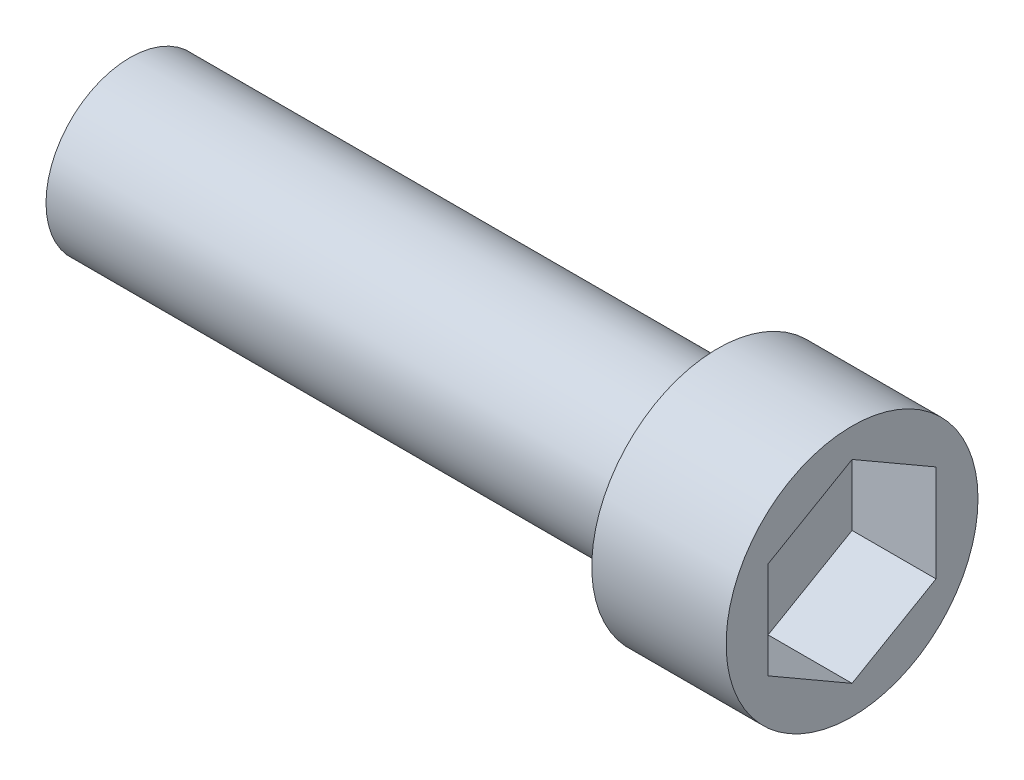
ISO-10303-21;
HEADER;
FILE_DESCRIPTION(('STEP AP214'),'2;1');
FILE_NAME('part.step','',(''),(''),'','','');
FILE_SCHEMA(('AUTOMOTIVE_DESIGN { 1 0 10303 214 1 1 1 1 }'));
ENDSEC;
DATA;
#1=APPLICATION_CONTEXT('core data for automotive mechanical design processes');
#2=APPLICATION_PROTOCOL_DEFINITION('international standard','automotive_design',2000,#1);
#3=PRODUCT_CONTEXT('',#1,'mechanical');
#4=PRODUCT('Part','Part','',(#3));
#5=PRODUCT_RELATED_PRODUCT_CATEGORY('part','',(#4));
#6=PRODUCT_DEFINITION_FORMATION('','',#4);
#7=PRODUCT_DEFINITION_CONTEXT('part definition',#1,'design');
#8=PRODUCT_DEFINITION('design','',#6,#7);
#9=PRODUCT_DEFINITION_SHAPE('','',#8);
#10=(LENGTH_UNIT() NAMED_UNIT(*) SI_UNIT(.MILLI.,.METRE.));
#11=(NAMED_UNIT(*) PLANE_ANGLE_UNIT() SI_UNIT($,.RADIAN.));
#12=(NAMED_UNIT(*) SI_UNIT($,.STERADIAN.) SOLID_ANGLE_UNIT());
#13=UNCERTAINTY_MEASURE_WITH_UNIT(LENGTH_MEASURE(1.E-05),#10,'distance_accuracy_value','');
#14=(GEOMETRIC_REPRESENTATION_CONTEXT(3) GLOBAL_UNCERTAINTY_ASSIGNED_CONTEXT((#13)) GLOBAL_UNIT_ASSIGNED_CONTEXT((#10,
#11,#12)) REPRESENTATION_CONTEXT('',''));
#15=CARTESIAN_POINT('',(0.,0.,0.));
#16=DIRECTION('',(0.,0.,1.));
#17=DIRECTION('',(1.,0.,0.));
#18=AXIS2_PLACEMENT_3D('',#15,#16,#17);
#19=CARTESIAN_POINT('',(8.,0.,0.));
#20=DIRECTION('',(-1.,0.,0.));
#21=DIRECTION('',(0.,0.,1.));
#22=AXIS2_PLACEMENT_3D('',#19,#20,#21);
#23=CYLINDRICAL_SURFACE('',#22,7.5);
#24=CARTESIAN_POINT('',(8.,0.,0.));
#25=DIRECTION('',(1.,0.,0.));
#26=DIRECTION('',(0.,0.,-1.));
#27=AXIS2_PLACEMENT_3D('',#24,#25,#26);
#28=CIRCLE('',#27,7.5);
#29=CARTESIAN_POINT('',(8.,0.,-7.5));
#30=VERTEX_POINT('',#29);
#31=EDGE_CURVE('E48',#30,#30,#28,.T.);
#32=ORIENTED_EDGE('',*,*,#31,.F.);
#33=EDGE_LOOP('',(#32));
#34=FACE_BOUND('',#33,.T.);
#35=CARTESIAN_POINT('',(0.,0.,0.));
#36=DIRECTION('',(1.,0.,0.));
#37=DIRECTION('',(0.,0.,-1.));
#38=AXIS2_PLACEMENT_3D('',#35,#36,#37);
#39=CIRCLE('',#38,7.5);
#40=CARTESIAN_POINT('',(0.,0.,-7.5));
#41=VERTEX_POINT('',#40);
#42=EDGE_CURVE('E143',#41,#41,#39,.T.);
#43=ORIENTED_EDGE('',*,*,#42,.T.);
#44=EDGE_LOOP('',(#43));
#45=FACE_BOUND('',#44,.T.);
#46=ADVANCED_FACE('F41',(#34,#45),#23,.T.);
#47=CARTESIAN_POINT('',(8.,0.,0.));
#48=DIRECTION('',(1.,0.,0.));
#49=DIRECTION('',(0.,0.,-1.));
#50=AXIS2_PLACEMENT_3D('',#47,#48,#49);
#51=PLANE('',#50);
#52=DIRECTION('',(0.,-0.5,-0.866025403784439));
#53=VECTOR('',#52,1.);
#54=CARTESIAN_POINT('',(8.,-2.88675134594815,5.00000000000004));
#55=LINE('',#54,#53);
#56=CARTESIAN_POINT('',(8.,-2.88675134594815,5.00000000000004));
#57=VERTEX_POINT('',#56);
#58=CARTESIAN_POINT('',(8.,-5.77350269189631,0.));
#59=VERTEX_POINT('',#58);
#60=EDGE_CURVE('E55',#57,#59,#55,.T.);
#61=ORIENTED_EDGE('',*,*,#60,.F.);
#62=DIRECTION('',(0.,-1.,0.));
#63=VECTOR('',#62,1.);
#64=CARTESIAN_POINT('',(8.,2.88675134594815,5.00000000000004));
#65=LINE('',#64,#63);
#66=CARTESIAN_POINT('',(8.,2.88675134594815,5.00000000000004));
#67=VERTEX_POINT('',#66);
#68=EDGE_CURVE('E139',#67,#57,#65,.T.);
#69=ORIENTED_EDGE('',*,*,#68,.F.);
#70=DIRECTION('',(0.,-0.5,0.866025403784439));
#71=VECTOR('',#70,1.);
#72=CARTESIAN_POINT('',(8.,5.77350269189631,0.));
#73=LINE('',#72,#71);
#74=CARTESIAN_POINT('',(8.,5.77350269189631,0.));
#75=VERTEX_POINT('',#74);
#76=EDGE_CURVE('E137',#75,#67,#73,.T.);
#77=ORIENTED_EDGE('',*,*,#76,.F.);
#78=DIRECTION('',(0.,0.5,0.866025403784439));
#79=VECTOR('',#78,1.);
#80=CARTESIAN_POINT('',(8.,2.88675134594815,-5.00000000000004));
#81=LINE('',#80,#79);
#82=CARTESIAN_POINT('',(8.,2.88675134594815,-5.00000000000004));
#83=VERTEX_POINT('',#82);
#84=EDGE_CURVE('E103',#83,#75,#81,.T.);
#85=ORIENTED_EDGE('',*,*,#84,.F.);
#86=DIRECTION('',(0.,1.,0.));
#87=VECTOR('',#86,1.);
#88=CARTESIAN_POINT('',(8.,-2.88675134594815,-5.00000000000004));
#89=LINE('',#88,#87);
#90=CARTESIAN_POINT('',(8.,-2.88675134594815,-5.00000000000004));
#91=VERTEX_POINT('',#90);
#92=EDGE_CURVE('E133',#91,#83,#89,.T.);
#93=ORIENTED_EDGE('',*,*,#92,.F.);
#94=DIRECTION('',(0.,0.5,-0.866025403784439));
#95=VECTOR('',#94,1.);
#96=CARTESIAN_POINT('',(8.,-5.77350269189631,0.));
#97=LINE('',#96,#95);
#98=EDGE_CURVE('E129',#59,#91,#97,.T.);
#99=ORIENTED_EDGE('',*,*,#98,.F.);
#100=EDGE_LOOP('',(#61,#69,#77,#85,#93,#99));
#101=FACE_BOUND('',#100,.T.);
#102=ORIENTED_EDGE('',*,*,#31,.T.);
#103=EDGE_LOOP('',(#102));
#104=FACE_BOUND('',#103,.T.);
#105=ADVANCED_FACE('F157',(#101,#104),#51,.T.);
#106=CARTESIAN_POINT('',(0.,0.,0.));
#107=DIRECTION('',(1.,0.,0.));
#108=DIRECTION('',(0.,0.,-1.));
#109=AXIS2_PLACEMENT_3D('',#106,#107,#108);
#110=PLANE('',#109);
#111=CARTESIAN_POINT('',(0.,0.,0.));
#112=DIRECTION('',(1.,0.,0.));
#113=DIRECTION('',(0.,0.,-1.));
#114=AXIS2_PLACEMENT_3D('',#111,#112,#113);
#115=CIRCLE('',#114,5.);
#116=CARTESIAN_POINT('',(0.,0.,-5.));
#117=VERTEX_POINT('',#116);
#118=EDGE_CURVE('E12',#117,#117,#115,.F.);
#119=ORIENTED_EDGE('',*,*,#118,.F.);
#120=EDGE_LOOP('',(#119));
#121=FACE_BOUND('',#120,.T.);
#122=ORIENTED_EDGE('',*,*,#42,.F.);
#123=EDGE_LOOP('',(#122));
#124=FACE_BOUND('',#123,.T.);
#125=ADVANCED_FACE('F154',(#121,#124),#110,.F.);
#126=CARTESIAN_POINT('',(3.,-2.88675134594815,5.00000000000004));
#127=DIRECTION('',(0.,-0.866025403784438,0.5));
#128=DIRECTION('',(0.,-0.5,-0.866025403784439));
#129=AXIS2_PLACEMENT_3D('',#126,#127,#128);
#130=PLANE('',#129);
#131=ORIENTED_EDGE('',*,*,#60,.T.);
#132=DIRECTION('',(1.,0.,0.));
#133=VECTOR('',#132,1.);
#134=CARTESIAN_POINT('',(3.,-5.77350269189631,0.));
#135=LINE('',#134,#133);
#136=CARTESIAN_POINT('',(3.,-5.77350269189631,0.));
#137=VERTEX_POINT('',#136);
#138=EDGE_CURVE('E85',#137,#59,#135,.T.);
#139=ORIENTED_EDGE('',*,*,#138,.F.);
#140=DIRECTION('',(0.,-0.5,-0.866025403784439));
#141=VECTOR('',#140,1.);
#142=CARTESIAN_POINT('',(3.,-2.88675134594815,5.00000000000004));
#143=LINE('',#142,#141);
#144=CARTESIAN_POINT('',(3.,-2.88675134594815,5.00000000000004));
#145=VERTEX_POINT('',#144);
#146=EDGE_CURVE('E141',#145,#137,#143,.T.);
#147=ORIENTED_EDGE('',*,*,#146,.F.);
#148=DIRECTION('',(1.,0.,0.));
#149=VECTOR('',#148,1.);
#150=CARTESIAN_POINT('',(3.,-2.88675134594815,5.00000000000004));
#151=LINE('',#150,#149);
#152=EDGE_CURVE('E63',#145,#57,#151,.T.);
#153=ORIENTED_EDGE('',*,*,#152,.T.);
#154=EDGE_LOOP('',(#131,#139,#147,#153));
#155=FACE_BOUND('',#154,.T.);
#156=ADVANCED_FACE('F156',(#155),#130,.F.);
#157=CARTESIAN_POINT('',(3.,2.88675134594815,5.00000000000004));
#158=DIRECTION('',(0.,0.,1.));
#159=DIRECTION('',(1.,0.,0.));
#160=AXIS2_PLACEMENT_3D('',#157,#158,#159);
#161=PLANE('',#160);
#162=ORIENTED_EDGE('',*,*,#68,.T.);
#163=ORIENTED_EDGE('',*,*,#152,.F.);
#164=DIRECTION('',(0.,-1.,0.));
#165=VECTOR('',#164,1.);
#166=CARTESIAN_POINT('',(3.,2.88675134594815,5.00000000000004));
#167=LINE('',#166,#165);
#168=CARTESIAN_POINT('',(3.,2.88675134594815,5.00000000000004));
#169=VERTEX_POINT('',#168);
#170=EDGE_CURVE('E115',#169,#145,#167,.T.);
#171=ORIENTED_EDGE('',*,*,#170,.F.);
#172=DIRECTION('',(1.,0.,0.));
#173=VECTOR('',#172,1.);
#174=CARTESIAN_POINT('',(3.,2.88675134594815,5.00000000000004));
#175=LINE('',#174,#173);
#176=EDGE_CURVE('E107',#169,#67,#175,.T.);
#177=ORIENTED_EDGE('',*,*,#176,.T.);
#178=EDGE_LOOP('',(#162,#163,#171,#177));
#179=FACE_BOUND('',#178,.T.);
#180=ADVANCED_FACE('F164',(#179),#161,.F.);
#181=CARTESIAN_POINT('',(3.,5.77350269189631,0.));
#182=DIRECTION('',(0.,0.866025403784438,0.5));
#183=DIRECTION('',(0.,-0.5,0.866025403784439));
#184=AXIS2_PLACEMENT_3D('',#181,#182,#183);
#185=PLANE('',#184);
#186=ORIENTED_EDGE('',*,*,#76,.T.);
#187=ORIENTED_EDGE('',*,*,#176,.F.);
#188=DIRECTION('',(0.,-0.5,0.866025403784439));
#189=VECTOR('',#188,1.);
#190=CARTESIAN_POINT('',(3.,5.77350269189631,0.));
#191=LINE('',#190,#189);
#192=CARTESIAN_POINT('',(3.,5.77350269189631,0.));
#193=VERTEX_POINT('',#192);
#194=EDGE_CURVE('E111',#193,#169,#191,.T.);
#195=ORIENTED_EDGE('',*,*,#194,.F.);
#196=DIRECTION('',(1.,0.,0.));
#197=VECTOR('',#196,1.);
#198=CARTESIAN_POINT('',(3.,5.77350269189631,0.));
#199=LINE('',#198,#197);
#200=EDGE_CURVE('E96',#193,#75,#199,.T.);
#201=ORIENTED_EDGE('',*,*,#200,.T.);
#202=EDGE_LOOP('',(#186,#187,#195,#201));
#203=FACE_BOUND('',#202,.T.);
#204=ADVANCED_FACE('F112',(#203),#185,.F.);
#205=CARTESIAN_POINT('',(3.,2.88675134594815,-5.00000000000004));
#206=DIRECTION('',(0.,0.866025403784438,-0.5));
#207=DIRECTION('',(0.,0.5,0.866025403784439));
#208=AXIS2_PLACEMENT_3D('',#205,#206,#207);
#209=PLANE('',#208);
#210=ORIENTED_EDGE('',*,*,#84,.T.);
#211=ORIENTED_EDGE('',*,*,#200,.F.);
#212=DIRECTION('',(0.,0.5,0.866025403784439));
#213=VECTOR('',#212,1.);
#214=CARTESIAN_POINT('',(3.,2.88675134594815,-5.00000000000004));
#215=LINE('',#214,#213);
#216=CARTESIAN_POINT('',(3.,2.88675134594815,-5.00000000000004));
#217=VERTEX_POINT('',#216);
#218=EDGE_CURVE('E100',#217,#193,#215,.T.);
#219=ORIENTED_EDGE('',*,*,#218,.F.);
#220=DIRECTION('',(1.,0.,0.));
#221=VECTOR('',#220,1.);
#222=CARTESIAN_POINT('',(3.,2.88675134594815,-5.00000000000004));
#223=LINE('',#222,#221);
#224=EDGE_CURVE('E108',#217,#83,#223,.T.);
#225=ORIENTED_EDGE('',*,*,#224,.T.);
#226=EDGE_LOOP('',(#210,#211,#219,#225));
#227=FACE_BOUND('',#226,.T.);
#228=ADVANCED_FACE('F98',(#227),#209,.F.);
#229=CARTESIAN_POINT('',(3.,-2.88675134594815,-5.00000000000004));
#230=DIRECTION('',(0.,0.,-1.));
#231=DIRECTION('',(-1.,0.,0.));
#232=AXIS2_PLACEMENT_3D('',#229,#230,#231);
#233=PLANE('',#232);
#234=ORIENTED_EDGE('',*,*,#92,.T.);
#235=ORIENTED_EDGE('',*,*,#224,.F.);
#236=DIRECTION('',(0.,1.,0.));
#237=VECTOR('',#236,1.);
#238=CARTESIAN_POINT('',(3.,-2.88675134594815,-5.00000000000004));
#239=LINE('',#238,#237);
#240=CARTESIAN_POINT('',(3.,-2.88675134594815,-5.00000000000004));
#241=VERTEX_POINT('',#240);
#242=EDGE_CURVE('E121',#241,#217,#239,.T.);
#243=ORIENTED_EDGE('',*,*,#242,.F.);
#244=DIRECTION('',(1.,0.,0.));
#245=VECTOR('',#244,1.);
#246=CARTESIAN_POINT('',(3.,-2.88675134594815,-5.00000000000004));
#247=LINE('',#246,#245);
#248=EDGE_CURVE('E146',#241,#91,#247,.T.);
#249=ORIENTED_EDGE('',*,*,#248,.T.);
#250=EDGE_LOOP('',(#234,#235,#243,#249));
#251=FACE_BOUND('',#250,.T.);
#252=ADVANCED_FACE('F214',(#251),#233,.F.);
#253=CARTESIAN_POINT('',(3.,-5.77350269189631,0.));
#254=DIRECTION('',(0.,-0.866025403784439,-0.5));
#255=DIRECTION('',(0.,0.5,-0.866025403784439));
#256=AXIS2_PLACEMENT_3D('',#253,#254,#255);
#257=PLANE('',#256);
#258=ORIENTED_EDGE('',*,*,#98,.T.);
#259=ORIENTED_EDGE('',*,*,#248,.F.);
#260=DIRECTION('',(0.,0.5,-0.866025403784439));
#261=VECTOR('',#260,1.);
#262=CARTESIAN_POINT('',(3.,-5.77350269189631,0.));
#263=LINE('',#262,#261);
#264=EDGE_CURVE('E123',#137,#241,#263,.T.);
#265=ORIENTED_EDGE('',*,*,#264,.F.);
#266=ORIENTED_EDGE('',*,*,#138,.T.);
#267=EDGE_LOOP('',(#258,#259,#265,#266));
#268=FACE_BOUND('',#267,.T.);
#269=ADVANCED_FACE('F223',(#268),#257,.F.);
#270=CARTESIAN_POINT('',(3.,0.,0.));
#271=DIRECTION('',(1.,0.,0.));
#272=DIRECTION('',(0.,0.,-1.));
#273=AXIS2_PLACEMENT_3D('',#270,#271,#272);
#274=PLANE('',#273);
#275=ORIENTED_EDGE('',*,*,#146,.T.);
#276=ORIENTED_EDGE('',*,*,#264,.T.);
#277=ORIENTED_EDGE('',*,*,#242,.T.);
#278=ORIENTED_EDGE('',*,*,#218,.T.);
#279=ORIENTED_EDGE('',*,*,#194,.T.);
#280=ORIENTED_EDGE('',*,*,#170,.T.);
#281=EDGE_LOOP('',(#275,#276,#277,#278,#279,#280));
#282=FACE_BOUND('',#281,.T.);
#283=ADVANCED_FACE('F118',(#282),#274,.T.);
#284=CARTESIAN_POINT('',(-35.,0.,0.));
#285=DIRECTION('',(-1.,0.,0.));
#286=DIRECTION('',(0.,0.,1.));
#287=AXIS2_PLACEMENT_3D('',#284,#285,#286);
#288=PLANE('',#287);
#289=CARTESIAN_POINT('',(-35.,0.,0.));
#290=DIRECTION('',(-1.,0.,0.));
#291=DIRECTION('',(0.,0.,1.));
#292=AXIS2_PLACEMENT_3D('',#289,#290,#291);
#293=CIRCLE('',#292,5.);
#294=CARTESIAN_POINT('',(-35.,0.,5.));
#295=VERTEX_POINT('',#294);
#296=EDGE_CURVE('E130',#295,#295,#293,.T.);
#297=ORIENTED_EDGE('',*,*,#296,.T.);
#298=EDGE_LOOP('',(#297));
#299=FACE_BOUND('',#298,.T.);
#300=CARTESIAN_POINT('',(-35.,0.,0.));
#301=DIRECTION('',(-1.,0.,0.));
#302=DIRECTION('',(0.,0.,1.));
#303=AXIS2_PLACEMENT_3D('',#300,#301,#302);
#304=CIRCLE('',#303,3.31);
#305=CARTESIAN_POINT('',(-35.,0.,3.31));
#306=VERTEX_POINT('',#305);
#307=EDGE_CURVE('E286',#306,#306,#304,.T.);
#308=ORIENTED_EDGE('',*,*,#307,.F.);
#309=EDGE_LOOP('',(#308));
#310=FACE_BOUND('',#309,.T.);
#311=ADVANCED_FACE('F241',(#299,#310),#288,.T.);
#312=CARTESIAN_POINT('',(-35.,0.,0.));
#313=DIRECTION('',(1.,0.,0.));
#314=DIRECTION('',(0.,0.,-1.));
#315=AXIS2_PLACEMENT_3D('',#312,#313,#314);
#316=CYLINDRICAL_SURFACE('',#315,5.);
#317=ORIENTED_EDGE('',*,*,#296,.F.);
#318=EDGE_LOOP('',(#317));
#319=FACE_BOUND('',#318,.T.);
#320=ORIENTED_EDGE('',*,*,#118,.T.);
#321=EDGE_LOOP('',(#320));
#322=FACE_BOUND('',#321,.T.);
#323=ADVANCED_FACE('F255',(#319,#322),#316,.T.);
#324=CARTESIAN_POINT('',(-35.,0.,0.));
#325=DIRECTION('',(1.,0.,0.));
#326=DIRECTION('',(0.,0.,-1.));
#327=AXIS2_PLACEMENT_3D('',#324,#325,#326);
#328=CYLINDRICAL_SURFACE('',#327,3.31);
#329=ORIENTED_EDGE('',*,*,#307,.T.);
#330=EDGE_LOOP('',(#329));
#331=FACE_BOUND('',#330,.T.);
#332=CARTESIAN_POINT('',(0.,0.,0.));
#333=DIRECTION('',(-1.,0.,0.));
#334=DIRECTION('',(0.,0.,1.));
#335=AXIS2_PLACEMENT_3D('',#332,#333,#334);
#336=CIRCLE('',#335,3.31);
#337=CARTESIAN_POINT('',(0.,0.,3.31));
#338=VERTEX_POINT('',#337);
#339=EDGE_CURVE('E289',#338,#338,#336,.T.);
#340=ORIENTED_EDGE('',*,*,#339,.F.);
#341=EDGE_LOOP('',(#340));
#342=FACE_BOUND('',#341,.T.);
#343=ADVANCED_FACE('F170',(#331,#342),#328,.F.);
#344=ORIENTED_EDGE('',*,*,#339,.T.);
#345=EDGE_LOOP('',(#344));
#346=FACE_BOUND('',#345,.T.);
#347=ADVANCED_FACE('F159',(#346),#110,.F.);
#348=CLOSED_SHELL('',(#46,#105,#125,#156,#180,#204,#228,#252,#269,#283,#311,#323,#343,#347));
#349=MANIFOLD_SOLID_BREP('B2',#348);
#350=ADVANCED_BREP_SHAPE_REPRESENTATION('',(#18,#349),#14);
#351=SHAPE_DEFINITION_REPRESENTATION(#9,#350);
ENDSEC;
END-ISO-10303-21;
